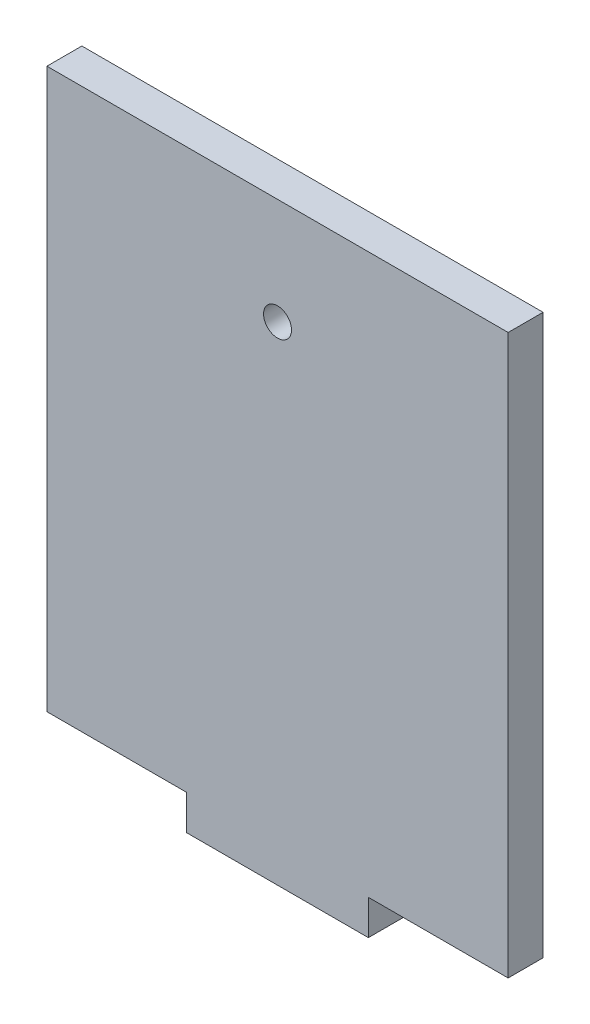
ISO-10303-21;
HEADER;
FILE_DESCRIPTION(('STEP AP214'),'2;1');
FILE_NAME('part.step','',(''),(''),'','','');
FILE_SCHEMA(('AUTOMOTIVE_DESIGN { 1 0 10303 214 1 1 1 1 }'));
ENDSEC;
DATA;
#1=APPLICATION_CONTEXT('core data for automotive mechanical design processes');
#2=APPLICATION_PROTOCOL_DEFINITION('international standard','automotive_design',2000,#1);
#3=PRODUCT_CONTEXT('',#1,'mechanical');
#4=PRODUCT('Part','Part','',(#3));
#5=PRODUCT_RELATED_PRODUCT_CATEGORY('part','',(#4));
#6=PRODUCT_DEFINITION_FORMATION('','',#4);
#7=PRODUCT_DEFINITION_CONTEXT('part definition',#1,'design');
#8=PRODUCT_DEFINITION('design','',#6,#7);
#9=PRODUCT_DEFINITION_SHAPE('','',#8);
#10=(LENGTH_UNIT() NAMED_UNIT(*) SI_UNIT(.MILLI.,.METRE.));
#11=(NAMED_UNIT(*) PLANE_ANGLE_UNIT() SI_UNIT($,.RADIAN.));
#12=(NAMED_UNIT(*) SI_UNIT($,.STERADIAN.) SOLID_ANGLE_UNIT());
#13=UNCERTAINTY_MEASURE_WITH_UNIT(LENGTH_MEASURE(1.E-05),#10,'distance_accuracy_value','');
#14=(GEOMETRIC_REPRESENTATION_CONTEXT(3) GLOBAL_UNCERTAINTY_ASSIGNED_CONTEXT((#13)) GLOBAL_UNIT_ASSIGNED_CONTEXT((#10,
#11,#12)) REPRESENTATION_CONTEXT('',''));
#15=CARTESIAN_POINT('',(0.,0.,0.));
#16=DIRECTION('',(0.,0.,1.));
#17=DIRECTION('',(1.,0.,0.));
#18=AXIS2_PLACEMENT_3D('',#15,#16,#17);
#19=CARTESIAN_POINT('',(12.7,3.175,3.175));
#20=DIRECTION('',(-1.,0.,0.));
#21=DIRECTION('',(0.,0.,1.));
#22=AXIS2_PLACEMENT_3D('',#19,#20,#21);
#23=PLANE('',#22);
#24=DIRECTION('',(0.,1.,0.));
#25=VECTOR('',#24,1.);
#26=CARTESIAN_POINT('',(12.7,3.175,0.));
#27=LINE('',#26,#25);
#28=CARTESIAN_POINT('',(12.7,3.175,0.));
#29=VERTEX_POINT('',#28);
#30=CARTESIAN_POINT('',(12.7,53.975,0.));
#31=VERTEX_POINT('',#30);
#32=EDGE_CURVE('E145',#29,#31,#27,.T.);
#33=ORIENTED_EDGE('',*,*,#32,.T.);
#34=DIRECTION('',(0.,0.,-1.));
#35=VECTOR('',#34,1.);
#36=CARTESIAN_POINT('',(12.7,53.975,3.175));
#37=LINE('',#36,#35);
#38=CARTESIAN_POINT('',(12.7,53.975,3.175));
#39=VERTEX_POINT('',#38);
#40=EDGE_CURVE('E11',#39,#31,#37,.T.);
#41=ORIENTED_EDGE('',*,*,#40,.F.);
#42=DIRECTION('',(0.,1.,0.));
#43=VECTOR('',#42,1.);
#44=CARTESIAN_POINT('',(12.7,3.175,3.175));
#45=LINE('',#44,#43);
#46=CARTESIAN_POINT('',(12.7,3.175,3.175));
#47=VERTEX_POINT('',#46);
#48=EDGE_CURVE('E171',#47,#39,#45,.T.);
#49=ORIENTED_EDGE('',*,*,#48,.F.);
#50=DIRECTION('',(0.,0.,-1.));
#51=VECTOR('',#50,1.);
#52=CARTESIAN_POINT('',(12.7,3.175,3.175));
#53=LINE('',#52,#51);
#54=EDGE_CURVE('E141',#47,#29,#53,.T.);
#55=ORIENTED_EDGE('',*,*,#54,.T.);
#56=EDGE_LOOP('',(#33,#41,#49,#55));
#57=FACE_BOUND('',#56,.T.);
#58=ADVANCED_FACE('F43',(#57),#23,.F.);
#59=CARTESIAN_POINT('',(12.7,53.975,3.175));
#60=DIRECTION('',(0.,-1.,0.));
#61=DIRECTION('',(0.,0.,-1.));
#62=AXIS2_PLACEMENT_3D('',#59,#60,#61);
#63=PLANE('',#62);
#64=DIRECTION('',(-1.,0.,0.));
#65=VECTOR('',#64,1.);
#66=CARTESIAN_POINT('',(12.7,53.975,0.));
#67=LINE('',#66,#65);
#68=CARTESIAN_POINT('',(-29.21,53.975,0.));
#69=VERTEX_POINT('',#68);
#70=EDGE_CURVE('E149',#31,#69,#67,.T.);
#71=ORIENTED_EDGE('',*,*,#70,.T.);
#72=DIRECTION('',(0.,0.,-1.));
#73=VECTOR('',#72,1.);
#74=CARTESIAN_POINT('',(-29.21,53.975,3.175));
#75=LINE('',#74,#73);
#76=CARTESIAN_POINT('',(-29.21,53.975,3.175));
#77=VERTEX_POINT('',#76);
#78=EDGE_CURVE('E52',#77,#69,#75,.T.);
#79=ORIENTED_EDGE('',*,*,#78,.F.);
#80=DIRECTION('',(-1.,0.,0.));
#81=VECTOR('',#80,1.);
#82=CARTESIAN_POINT('',(12.7,53.975,3.175));
#83=LINE('',#82,#81);
#84=EDGE_CURVE('E103',#39,#77,#83,.T.);
#85=ORIENTED_EDGE('',*,*,#84,.F.);
#86=ORIENTED_EDGE('',*,*,#40,.T.);
#87=EDGE_LOOP('',(#71,#79,#85,#86));
#88=FACE_BOUND('',#87,.T.);
#89=ADVANCED_FACE('F190',(#88),#63,.F.);
#90=CARTESIAN_POINT('',(-29.21,3.175,3.175));
#91=DIRECTION('',(-1.,0.,0.));
#92=DIRECTION('',(0.,-1.,0.));
#93=AXIS2_PLACEMENT_3D('',#90,#91,#92);
#94=PLANE('',#93);
#95=DIRECTION('',(0.,1.,0.));
#96=VECTOR('',#95,1.);
#97=CARTESIAN_POINT('',(-29.21,3.175,0.));
#98=LINE('',#97,#96);
#99=CARTESIAN_POINT('',(-29.21,3.175,0.));
#100=VERTEX_POINT('',#99);
#101=EDGE_CURVE('E154',#100,#69,#98,.T.);
#102=ORIENTED_EDGE('',*,*,#101,.F.);
#103=DIRECTION('',(0.,0.,-1.));
#104=VECTOR('',#103,1.);
#105=CARTESIAN_POINT('',(-29.21,3.175,3.175));
#106=LINE('',#105,#104);
#107=CARTESIAN_POINT('',(-29.21,3.175,3.175));
#108=VERTEX_POINT('',#107);
#109=EDGE_CURVE('E181',#108,#100,#106,.T.);
#110=ORIENTED_EDGE('',*,*,#109,.F.);
#111=DIRECTION('',(0.,1.,0.));
#112=VECTOR('',#111,1.);
#113=CARTESIAN_POINT('',(-29.21,3.175,3.175));
#114=LINE('',#113,#112);
#115=EDGE_CURVE('E189',#108,#77,#114,.T.);
#116=ORIENTED_EDGE('',*,*,#115,.T.);
#117=ORIENTED_EDGE('',*,*,#78,.T.);
#118=EDGE_LOOP('',(#102,#110,#116,#117));
#119=FACE_BOUND('',#118,.T.);
#120=ADVANCED_FACE('F187',(#119),#94,.T.);
#121=CARTESIAN_POINT('',(-16.51,3.175,3.175));
#122=DIRECTION('',(0.,-1.,0.));
#123=DIRECTION('',(1.,0.,0.));
#124=AXIS2_PLACEMENT_3D('',#121,#122,#123);
#125=PLANE('',#124);
#126=DIRECTION('',(-1.,0.,0.));
#127=VECTOR('',#126,1.);
#128=CARTESIAN_POINT('',(-16.51,3.175,0.));
#129=LINE('',#128,#127);
#130=CARTESIAN_POINT('',(-16.51,3.175,0.));
#131=VERTEX_POINT('',#130);
#132=EDGE_CURVE('E158',#131,#100,#129,.T.);
#133=ORIENTED_EDGE('',*,*,#132,.F.);
#134=DIRECTION('',(0.,0.,-1.));
#135=VECTOR('',#134,1.);
#136=CARTESIAN_POINT('',(-16.51,3.175,3.175));
#137=LINE('',#136,#135);
#138=CARTESIAN_POINT('',(-16.51,3.175,3.175));
#139=VERTEX_POINT('',#138);
#140=EDGE_CURVE('E178',#139,#131,#137,.T.);
#141=ORIENTED_EDGE('',*,*,#140,.F.);
#142=DIRECTION('',(-1.,0.,0.));
#143=VECTOR('',#142,1.);
#144=CARTESIAN_POINT('',(-16.51,3.175,3.175));
#145=LINE('',#144,#143);
#146=EDGE_CURVE('E200',#139,#108,#145,.T.);
#147=ORIENTED_EDGE('',*,*,#146,.T.);
#148=ORIENTED_EDGE('',*,*,#109,.T.);
#149=EDGE_LOOP('',(#133,#141,#147,#148));
#150=FACE_BOUND('',#149,.T.);
#151=ADVANCED_FACE('F198',(#150),#125,.T.);
#152=CARTESIAN_POINT('',(-16.51,3.175,3.175));
#153=DIRECTION('',(1.,0.,0.));
#154=DIRECTION('',(0.,0.,-1.));
#155=AXIS2_PLACEMENT_3D('',#152,#153,#154);
#156=PLANE('',#155);
#157=DIRECTION('',(0.,-1.,0.));
#158=VECTOR('',#157,1.);
#159=CARTESIAN_POINT('',(-16.51,3.175,0.));
#160=LINE('',#159,#158);
#161=CARTESIAN_POINT('',(-16.51,0.,0.));
#162=VERTEX_POINT('',#161);
#163=EDGE_CURVE('E162',#131,#162,#160,.T.);
#164=ORIENTED_EDGE('',*,*,#163,.T.);
#165=DIRECTION('',(0.,0.,-1.));
#166=VECTOR('',#165,1.);
#167=CARTESIAN_POINT('',(-16.51,0.,3.175));
#168=LINE('',#167,#166);
#169=CARTESIAN_POINT('',(-16.51,0.,3.175));
#170=VERTEX_POINT('',#169);
#171=EDGE_CURVE('E134',#170,#162,#168,.T.);
#172=ORIENTED_EDGE('',*,*,#171,.F.);
#173=DIRECTION('',(0.,-1.,0.));
#174=VECTOR('',#173,1.);
#175=CARTESIAN_POINT('',(-16.51,3.175,3.175));
#176=LINE('',#175,#174);
#177=EDGE_CURVE('E123',#139,#170,#176,.T.);
#178=ORIENTED_EDGE('',*,*,#177,.F.);
#179=ORIENTED_EDGE('',*,*,#140,.T.);
#180=EDGE_LOOP('',(#164,#172,#178,#179));
#181=FACE_BOUND('',#180,.T.);
#182=ADVANCED_FACE('F248',(#181),#156,.F.);
#183=CARTESIAN_POINT('',(-16.51,0.,3.175));
#184=DIRECTION('',(0.,1.,0.));
#185=DIRECTION('',(0.,0.,1.));
#186=AXIS2_PLACEMENT_3D('',#183,#184,#185);
#187=PLANE('',#186);
#188=DIRECTION('',(1.,0.,0.));
#189=VECTOR('',#188,1.);
#190=CARTESIAN_POINT('',(-16.51,0.,0.));
#191=LINE('',#190,#189);
#192=CARTESIAN_POINT('',(0.,0.,0.));
#193=VERTEX_POINT('',#192);
#194=EDGE_CURVE('E132',#162,#193,#191,.T.);
#195=ORIENTED_EDGE('',*,*,#194,.T.);
#196=DIRECTION('',(0.,0.,-1.));
#197=VECTOR('',#196,1.);
#198=CARTESIAN_POINT('',(0.,0.,3.175));
#199=LINE('',#198,#197);
#200=CARTESIAN_POINT('',(0.,0.,3.175));
#201=VERTEX_POINT('',#200);
#202=EDGE_CURVE('E129',#201,#193,#199,.T.);
#203=ORIENTED_EDGE('',*,*,#202,.F.);
#204=DIRECTION('',(1.,0.,0.));
#205=VECTOR('',#204,1.);
#206=CARTESIAN_POINT('',(-16.51,0.,3.175));
#207=LINE('',#206,#205);
#208=EDGE_CURVE('E116',#170,#201,#207,.T.);
#209=ORIENTED_EDGE('',*,*,#208,.F.);
#210=ORIENTED_EDGE('',*,*,#171,.T.);
#211=EDGE_LOOP('',(#195,#203,#209,#210));
#212=FACE_BOUND('',#211,.T.);
#213=ADVANCED_FACE('F130',(#212),#187,.F.);
#214=CARTESIAN_POINT('',(0.,0.,3.175));
#215=DIRECTION('',(-1.,0.,0.));
#216=DIRECTION('',(0.,0.,1.));
#217=AXIS2_PLACEMENT_3D('',#214,#215,#216);
#218=PLANE('',#217);
#219=DIRECTION('',(0.,1.,0.));
#220=VECTOR('',#219,1.);
#221=CARTESIAN_POINT('',(0.,0.,0.));
#222=LINE('',#221,#220);
#223=CARTESIAN_POINT('',(0.,3.175,0.));
#224=VERTEX_POINT('',#223);
#225=EDGE_CURVE('E89',#193,#224,#222,.T.);
#226=ORIENTED_EDGE('',*,*,#225,.T.);
#227=DIRECTION('',(0.,0.,-1.));
#228=VECTOR('',#227,1.);
#229=CARTESIAN_POINT('',(0.,3.175,3.175));
#230=LINE('',#229,#228);
#231=CARTESIAN_POINT('',(0.,3.175,3.175));
#232=VERTEX_POINT('',#231);
#233=EDGE_CURVE('E135',#232,#224,#230,.T.);
#234=ORIENTED_EDGE('',*,*,#233,.F.);
#235=DIRECTION('',(0.,1.,0.));
#236=VECTOR('',#235,1.);
#237=CARTESIAN_POINT('',(0.,0.,3.175));
#238=LINE('',#237,#236);
#239=EDGE_CURVE('E120',#201,#232,#238,.T.);
#240=ORIENTED_EDGE('',*,*,#239,.F.);
#241=ORIENTED_EDGE('',*,*,#202,.T.);
#242=EDGE_LOOP('',(#226,#234,#240,#241));
#243=FACE_BOUND('',#242,.T.);
#244=ADVANCED_FACE('F137',(#243),#218,.F.);
#245=CARTESIAN_POINT('',(0.,3.175,3.175));
#246=DIRECTION('',(0.,1.,0.));
#247=DIRECTION('',(0.,0.,1.));
#248=AXIS2_PLACEMENT_3D('',#245,#246,#247);
#249=PLANE('',#248);
#250=DIRECTION('',(1.,0.,0.));
#251=VECTOR('',#250,1.);
#252=CARTESIAN_POINT('',(0.,3.175,0.));
#253=LINE('',#252,#251);
#254=EDGE_CURVE('E95',#224,#29,#253,.T.);
#255=ORIENTED_EDGE('',*,*,#254,.T.);
#256=ORIENTED_EDGE('',*,*,#54,.F.);
#257=DIRECTION('',(1.,0.,0.));
#258=VECTOR('',#257,1.);
#259=CARTESIAN_POINT('',(0.,3.175,3.175));
#260=LINE('',#259,#258);
#261=EDGE_CURVE('E60',#232,#47,#260,.T.);
#262=ORIENTED_EDGE('',*,*,#261,.F.);
#263=ORIENTED_EDGE('',*,*,#233,.T.);
#264=EDGE_LOOP('',(#255,#256,#262,#263));
#265=FACE_BOUND('',#264,.T.);
#266=ADVANCED_FACE('F227',(#265),#249,.F.);
#267=CARTESIAN_POINT('',(0.,0.,3.175));
#268=DIRECTION('',(0.,0.,1.));
#269=DIRECTION('',(1.,0.,0.));
#270=AXIS2_PLACEMENT_3D('',#267,#268,#269);
#271=PLANE('',#270);
#272=CARTESIAN_POINT('',(-8.255,44.323,3.175));
#273=DIRECTION('',(0.,0.,1.));
#274=DIRECTION('',(1.,0.,0.));
#275=AXIS2_PLACEMENT_3D('',#272,#273,#274);
#276=CIRCLE('',#275,1.27);
#277=CARTESIAN_POINT('',(-6.985,44.323,3.175));
#278=VERTEX_POINT('',#277);
#279=EDGE_CURVE('E211',#278,#278,#276,.T.);
#280=ORIENTED_EDGE('',*,*,#279,.F.);
#281=EDGE_LOOP('',(#280));
#282=FACE_BOUND('',#281,.T.);
#283=ORIENTED_EDGE('',*,*,#48,.T.);
#284=ORIENTED_EDGE('',*,*,#84,.T.);
#285=ORIENTED_EDGE('',*,*,#115,.F.);
#286=ORIENTED_EDGE('',*,*,#146,.F.);
#287=ORIENTED_EDGE('',*,*,#177,.T.);
#288=ORIENTED_EDGE('',*,*,#208,.T.);
#289=ORIENTED_EDGE('',*,*,#239,.T.);
#290=ORIENTED_EDGE('',*,*,#261,.T.);
#291=EDGE_LOOP('',(#283,#284,#285,#286,#287,#288,#289,#290));
#292=FACE_BOUND('',#291,.T.);
#293=ADVANCED_FACE('F118',(#282,#292),#271,.T.);
#294=CARTESIAN_POINT('',(0.,0.,0.));
#295=DIRECTION('',(0.,0.,1.));
#296=DIRECTION('',(1.,0.,0.));
#297=AXIS2_PLACEMENT_3D('',#294,#295,#296);
#298=PLANE('',#297);
#299=CARTESIAN_POINT('',(-8.255,44.323,0.));
#300=DIRECTION('',(0.,0.,1.));
#301=DIRECTION('',(1.,0.,0.));
#302=AXIS2_PLACEMENT_3D('',#299,#300,#301);
#303=CIRCLE('',#302,1.27);
#304=CARTESIAN_POINT('',(-6.985,44.323,0.));
#305=VERTEX_POINT('',#304);
#306=EDGE_CURVE('E150',#305,#305,#303,.T.);
#307=ORIENTED_EDGE('',*,*,#306,.T.);
#308=EDGE_LOOP('',(#307));
#309=FACE_BOUND('',#308,.T.);
#310=ORIENTED_EDGE('',*,*,#32,.F.);
#311=ORIENTED_EDGE('',*,*,#254,.F.);
#312=ORIENTED_EDGE('',*,*,#225,.F.);
#313=ORIENTED_EDGE('',*,*,#194,.F.);
#314=ORIENTED_EDGE('',*,*,#163,.F.);
#315=ORIENTED_EDGE('',*,*,#132,.T.);
#316=ORIENTED_EDGE('',*,*,#101,.T.);
#317=ORIENTED_EDGE('',*,*,#70,.F.);
#318=EDGE_LOOP('',(#310,#311,#312,#313,#314,#315,#316,#317));
#319=FACE_BOUND('',#318,.T.);
#320=ADVANCED_FACE('F194',(#309,#319),#298,.F.);
#321=CARTESIAN_POINT('',(-8.255,44.323,0.));
#322=DIRECTION('',(0.,0.,1.));
#323=DIRECTION('',(1.,0.,0.));
#324=AXIS2_PLACEMENT_3D('',#321,#322,#323);
#325=CYLINDRICAL_SURFACE('',#324,1.27);
#326=ORIENTED_EDGE('',*,*,#306,.F.);
#327=EDGE_LOOP('',(#326));
#328=FACE_BOUND('',#327,.T.);
#329=ORIENTED_EDGE('',*,*,#279,.T.);
#330=EDGE_LOOP('',(#329));
#331=FACE_BOUND('',#330,.T.);
#332=ADVANCED_FACE('F220',(#328,#331),#325,.F.);
#333=CLOSED_SHELL('',(#58,#89,#120,#151,#182,#213,#244,#266,#293,#320,#332));
#334=MANIFOLD_SOLID_BREP('B2',#333);
#335=ADVANCED_BREP_SHAPE_REPRESENTATION('',(#18,#334),#14);
#336=SHAPE_DEFINITION_REPRESENTATION(#9,#335);
ENDSEC;
END-ISO-10303-21;
